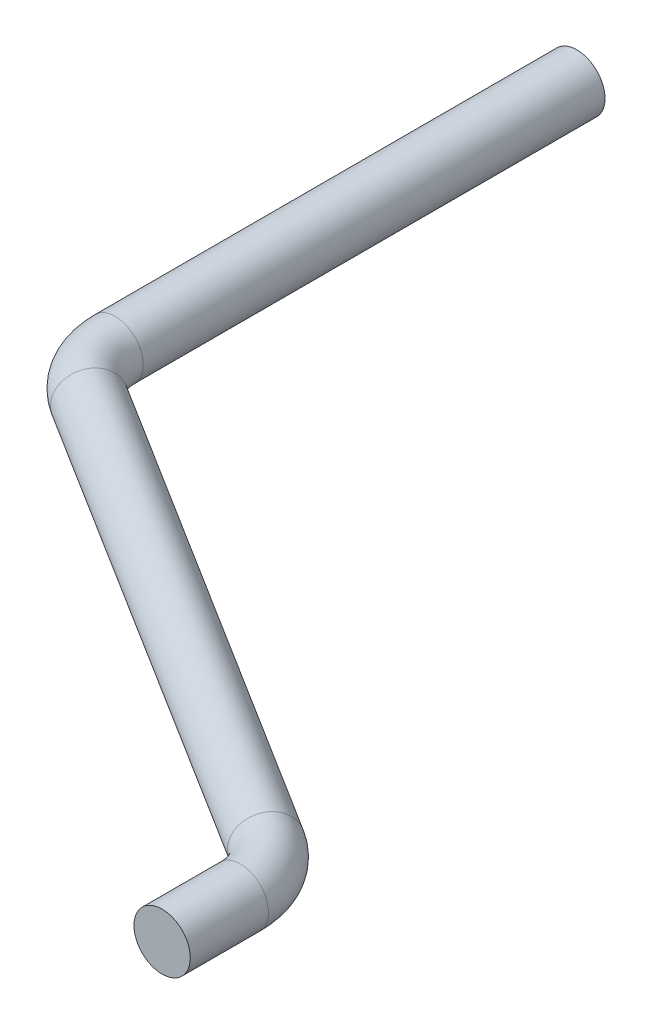
ISO-10303-21;
HEADER;
FILE_DESCRIPTION(('STEP AP214'),'2;1');
FILE_NAME('part.step','',(''),(''),'','','');
FILE_SCHEMA(('AUTOMOTIVE_DESIGN { 1 0 10303 214 1 1 1 1 }'));
ENDSEC;
DATA;
#1=APPLICATION_CONTEXT('core data for automotive mechanical design processes');
#2=APPLICATION_PROTOCOL_DEFINITION('international standard','automotive_design',2000,#1);
#3=PRODUCT_CONTEXT('',#1,'mechanical');
#4=PRODUCT('Part','Part','',(#3));
#5=PRODUCT_RELATED_PRODUCT_CATEGORY('part','',(#4));
#6=PRODUCT_DEFINITION_FORMATION('','',#4);
#7=PRODUCT_DEFINITION_CONTEXT('part definition',#1,'design');
#8=PRODUCT_DEFINITION('design','',#6,#7);
#9=PRODUCT_DEFINITION_SHAPE('','',#8);
#10=(LENGTH_UNIT() NAMED_UNIT(*) SI_UNIT(.MILLI.,.METRE.));
#11=(NAMED_UNIT(*) PLANE_ANGLE_UNIT() SI_UNIT($,.RADIAN.));
#12=(NAMED_UNIT(*) SI_UNIT($,.STERADIAN.) SOLID_ANGLE_UNIT());
#13=UNCERTAINTY_MEASURE_WITH_UNIT(LENGTH_MEASURE(1.E-05),#10,'distance_accuracy_value','');
#14=(GEOMETRIC_REPRESENTATION_CONTEXT(3) GLOBAL_UNCERTAINTY_ASSIGNED_CONTEXT((#13)) GLOBAL_UNIT_ASSIGNED_CONTEXT((#10,
#11,#12)) REPRESENTATION_CONTEXT('',''));
#15=CARTESIAN_POINT('',(0.,0.,0.));
#16=DIRECTION('',(0.,0.,1.));
#17=DIRECTION('',(1.,0.,0.));
#18=AXIS2_PLACEMENT_3D('',#15,#16,#17);
#19=CARTESIAN_POINT('',(22.6978592991853,-725.488587030605,1717.53596893297));
#20=DIRECTION('',(0.,0.,1.));
#21=DIRECTION('',(1.,0.,0.));
#22=AXIS2_PLACEMENT_3D('',#19,#20,#21);
#23=PLANE('',#22);
#24=CARTESIAN_POINT('',(22.6978592991853,-725.488587030605,1717.53596893297));
#25=DIRECTION('',(0.,0.,1.));
#26=DIRECTION('',(1.,0.,0.));
#27=AXIS2_PLACEMENT_3D('',#24,#25,#26);
#28=CIRCLE('',#27,16.5);
#29=CARTESIAN_POINT('',(39.1978592991853,-725.488587030605,1717.53596893297));
#30=VERTEX_POINT('',#29);
#31=EDGE_CURVE('E57',#30,#30,#28,.T.);
#32=ORIENTED_EDGE('',*,*,#31,.T.);
#33=EDGE_LOOP('',(#32));
#34=FACE_BOUND('',#33,.T.);
#35=ADVANCED_FACE('F45',(#34),#23,.T.);
#36=CARTESIAN_POINT('',(-291.659822388104,-725.488587030554,1160.31023470782));
#37=DIRECTION('',(0.,0.,1.));
#38=DIRECTION('',(1.,0.,0.));
#39=AXIS2_PLACEMENT_3D('',#36,#37,#38);
#40=PLANE('',#39);
#41=CARTESIAN_POINT('',(-291.659822388104,-725.488587030554,1160.31023470782));
#42=DIRECTION('',(0.,0.,1.));
#43=DIRECTION('',(1.,0.,0.));
#44=AXIS2_PLACEMENT_3D('',#41,#42,#43);
#45=CIRCLE('',#44,16.5);
#46=CARTESIAN_POINT('',(-275.159822388104,-725.488587030554,1160.31023470782));
#47=VERTEX_POINT('',#46);
#48=EDGE_CURVE('E12',#47,#47,#45,.T.);
#49=ORIENTED_EDGE('',*,*,#48,.F.);
#50=EDGE_LOOP('',(#49));
#51=FACE_BOUND('',#50,.T.);
#52=ADVANCED_FACE('F63',(#51),#40,.F.);
#53=CARTESIAN_POINT('',(22.6978592991853,-725.488587030605,1717.53596893297));
#54=DIRECTION('',(0.,0.,-1.));
#55=DIRECTION('',(-1.,0.,0.));
#56=AXIS2_PLACEMENT_3D('',#53,#54,#55);
#57=CYLINDRICAL_SURFACE('',#56,16.5);
#58=CARTESIAN_POINT('',(22.6978592991853,-725.488587030605,1671.72880425256));
#59=DIRECTION('',(0.,0.,1.));
#60=DIRECTION('',(1.,0.,0.));
#61=AXIS2_PLACEMENT_3D('',#58,#59,#60);
#62=CIRCLE('',#61,16.5);
#63=CARTESIAN_POINT('',(39.1978592991853,-725.488587030605,1671.72880425254));
#64=VERTEX_POINT('',#63);
#65=EDGE_CURVE('E97',#64,#64,#62,.T.);
#66=ORIENTED_EDGE('',*,*,#65,.T.);
#67=EDGE_LOOP('',(#66));
#68=FACE_BOUND('',#67,.T.);
#69=ORIENTED_EDGE('',*,*,#31,.F.);
#70=EDGE_LOOP('',(#69));
#71=FACE_BOUND('',#70,.T.);
#72=ADVANCED_FACE('F65',(#68,#71),#57,.T.);
#73=CARTESIAN_POINT('',(-17.3021407008147,-725.488587030605,1671.72880425258));
#74=DIRECTION('',(0.,1.,0.));
#75=DIRECTION('',(0.,0.,1.));
#76=AXIS2_PLACEMENT_3D('',#73,#74,#75);
#77=TOROIDAL_SURFACE('',#76,40.,16.5);
#78=CARTESIAN_POINT('',(3.91586042698955,-725.488587030564,1637.82015597312));
#79=DIRECTION('',(0.847716206986638,0.,0.530450028195106));
#80=DIRECTION('',(0.530450028195106,0.,-0.847716206986638));
#81=AXIS2_PLACEMENT_3D('',#78,#79,#80);
#82=CIRCLE('',#81,16.5);
#83=CARTESIAN_POINT('',(12.6682858922088,-725.488587030547,1623.83283855784));
#84=VERTEX_POINT('',#83);
#85=EDGE_CURVE('E94',#84,#84,#82,.T.);
#86=CARTESIAN_POINT('',(-17.3021407008147,-725.488587030605,1671.72880425258));
#87=DIRECTION('',(0.,1.,0.));
#88=DIRECTION('',(0.,0.,1.));
#89=AXIS2_PLACEMENT_3D('',#86,#87,#88);
#90=CIRCLE('',#89,56.5);
#91=EDGE_CURVE('',#64,#84,#90,.T.);
#92=ORIENTED_EDGE('',*,*,#65,.F.);
#93=ORIENTED_EDGE('',*,*,#85,.T.);
#94=ORIENTED_EDGE('',*,*,#91,.T.);
#95=ORIENTED_EDGE('',*,*,#91,.F.);
#96=EDGE_LOOP('',(#92,#94,#93,#95));
#97=FACE_BOUND('',#96,.T.);
#98=ADVANCED_FACE('F70',(#97),#77,.T.);
#99=CARTESIAN_POINT('',(3.91586042698966,-725.488587030564,1637.82015597312));
#100=DIRECTION('',(-0.847716206986637,0.,-0.530450028195106));
#101=DIRECTION('',(-0.530450028195106,0.,0.847716206986637));
#102=AXIS2_PLACEMENT_3D('',#99,#100,#101);
#103=CYLINDRICAL_SURFACE('',#102,16.5);
#104=CARTESIAN_POINT('',(-272.877823515908,-725.488587030565,1464.61924717646));
#105=DIRECTION('',(0.847716206986637,0.,0.530450028195106));
#106=DIRECTION('',(0.530450028195106,0.,-0.847716206986637));
#107=AXIS2_PLACEMENT_3D('',#104,#105,#106);
#108=CIRCLE('',#107,16.5);
#109=CARTESIAN_POINT('',(-281.630248981127,-725.488587030565,1478.60656459174));
#110=VERTEX_POINT('',#109);
#111=EDGE_CURVE('E99',#110,#110,#108,.T.);
#112=ORIENTED_EDGE('',*,*,#111,.T.);
#113=EDGE_LOOP('',(#112));
#114=FACE_BOUND('',#113,.T.);
#115=ORIENTED_EDGE('',*,*,#85,.F.);
#116=EDGE_LOOP('',(#115));
#117=FACE_BOUND('',#116,.T.);
#118=ADVANCED_FACE('F80',(#114,#117),#103,.T.);
#119=CARTESIAN_POINT('',(-251.659822388104,-725.488587030563,1430.710598897));
#120=DIRECTION('',(0.,-1.,0.));
#121=DIRECTION('',(0.,0.,-1.));
#122=AXIS2_PLACEMENT_3D('',#119,#120,#121);
#123=TOROIDAL_SURFACE('',#122,40.,16.5);
#124=CARTESIAN_POINT('',(-291.659822388104,-725.488587030603,1430.71059889697));
#125=DIRECTION('',(0.,0.,1.));
#126=DIRECTION('',(1.,0.,0.));
#127=AXIS2_PLACEMENT_3D('',#124,#125,#126);
#128=CIRCLE('',#127,16.5);
#129=CARTESIAN_POINT('',(-308.159822388104,-725.48858703062,1430.71059889696));
#130=VERTEX_POINT('',#129);
#131=EDGE_CURVE('E52',#130,#130,#128,.T.);
#132=CARTESIAN_POINT('',(-251.659822388104,-725.488587030563,1430.710598897));
#133=DIRECTION('',(0.,-1.,0.));
#134=DIRECTION('',(0.,0.,-1.));
#135=AXIS2_PLACEMENT_3D('',#132,#133,#134);
#136=CIRCLE('',#135,56.5);
#137=EDGE_CURVE('',#110,#130,#136,.T.);
#138=ORIENTED_EDGE('',*,*,#111,.F.);
#139=ORIENTED_EDGE('',*,*,#131,.T.);
#140=ORIENTED_EDGE('',*,*,#137,.T.);
#141=ORIENTED_EDGE('',*,*,#137,.F.);
#142=EDGE_LOOP('',(#138,#140,#139,#141));
#143=FACE_BOUND('',#142,.T.);
#144=ADVANCED_FACE('F76',(#143),#123,.T.);
#145=CARTESIAN_POINT('',(-291.659822388104,-725.488587030564,1430.710598897));
#146=DIRECTION('',(0.,0.,-1.));
#147=DIRECTION('',(0.,1.,0.));
#148=AXIS2_PLACEMENT_3D('',#145,#146,#147);
#149=CYLINDRICAL_SURFACE('',#148,16.5);
#150=ORIENTED_EDGE('',*,*,#48,.T.);
#151=EDGE_LOOP('',(#150));
#152=FACE_BOUND('',#151,.T.);
#153=ORIENTED_EDGE('',*,*,#131,.F.);
#154=EDGE_LOOP('',(#153));
#155=FACE_BOUND('',#154,.T.);
#156=ADVANCED_FACE('F60',(#152,#155),#149,.T.);
#157=CLOSED_SHELL('',(#35,#52,#72,#98,#118,#144,#156));
#158=MANIFOLD_SOLID_BREP('B2',#157);
#159=ADVANCED_BREP_SHAPE_REPRESENTATION('',(#18,#158),#14);
#160=SHAPE_DEFINITION_REPRESENTATION(#9,#159);
ENDSEC;
END-ISO-10303-21;
